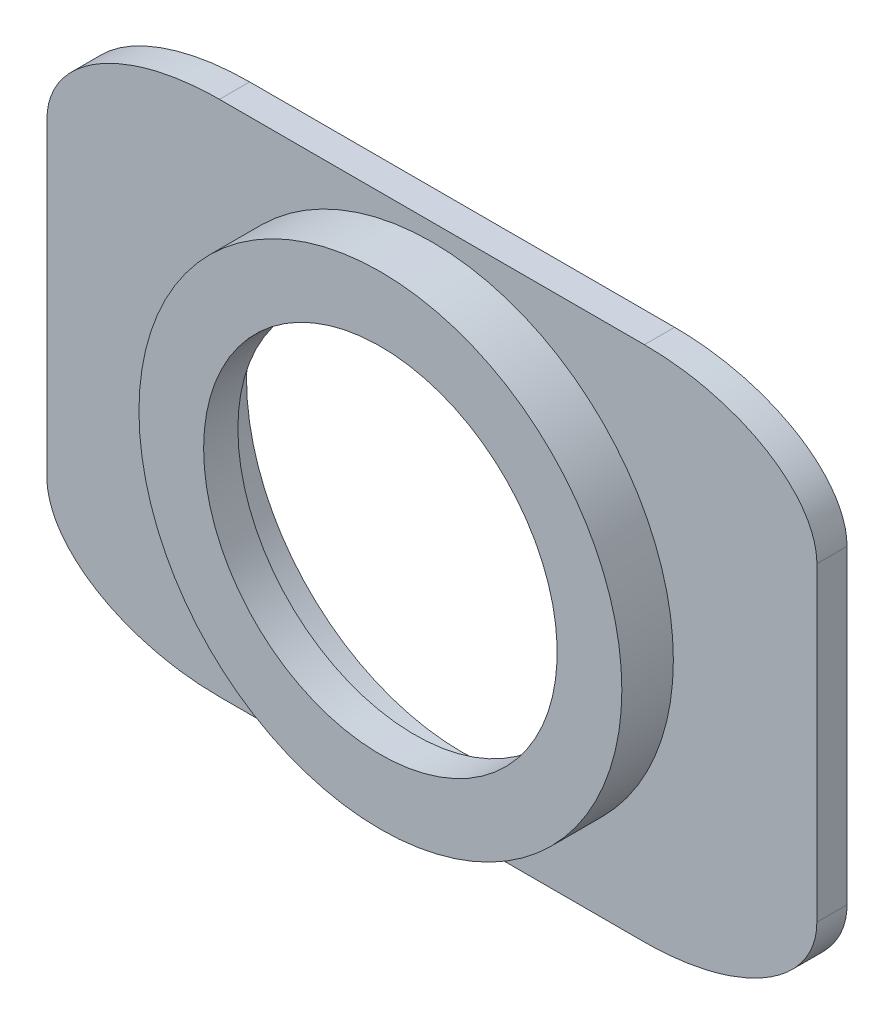
ISO-10303-21;
HEADER;
FILE_DESCRIPTION(('STEP AP214'),'2;1');
FILE_NAME('part.step','',(''),(''),'','','');
FILE_SCHEMA(('AUTOMOTIVE_DESIGN { 1 0 10303 214 1 1 1 1 }'));
ENDSEC;
DATA;
#1=APPLICATION_CONTEXT('core data for automotive mechanical design processes');
#2=APPLICATION_PROTOCOL_DEFINITION('international standard','automotive_design',2000,#1);
#3=PRODUCT_CONTEXT('',#1,'mechanical');
#4=PRODUCT('Part','Part','',(#3));
#5=PRODUCT_RELATED_PRODUCT_CATEGORY('part','',(#4));
#6=PRODUCT_DEFINITION_FORMATION('','',#4);
#7=PRODUCT_DEFINITION_CONTEXT('part definition',#1,'design');
#8=PRODUCT_DEFINITION('design','',#6,#7);
#9=PRODUCT_DEFINITION_SHAPE('','',#8);
#10=(LENGTH_UNIT() NAMED_UNIT(*) SI_UNIT(.MILLI.,.METRE.));
#11=(NAMED_UNIT(*) PLANE_ANGLE_UNIT() SI_UNIT($,.RADIAN.));
#12=(NAMED_UNIT(*) SI_UNIT($,.STERADIAN.) SOLID_ANGLE_UNIT());
#13=UNCERTAINTY_MEASURE_WITH_UNIT(LENGTH_MEASURE(1.E-05),#10,'distance_accuracy_value','');
#14=(GEOMETRIC_REPRESENTATION_CONTEXT(3) GLOBAL_UNCERTAINTY_ASSIGNED_CONTEXT((#13)) GLOBAL_UNIT_ASSIGNED_CONTEXT((#10,
#11,#12)) REPRESENTATION_CONTEXT('',''));
#15=CARTESIAN_POINT('',(0.,0.,0.));
#16=DIRECTION('',(0.,0.,1.));
#17=DIRECTION('',(1.,0.,0.));
#18=AXIS2_PLACEMENT_3D('',#15,#16,#17);
#19=CARTESIAN_POINT('',(-31.9395050243321,60.,4.10871596133464));
#20=DIRECTION('',(0.,0.,-1.));
#21=DIRECTION('',(-1.,0.,0.));
#22=AXIS2_PLACEMENT_3D('',#19,#20,#21);
#23=PLANE('',#22);
#24=CARTESIAN_POINT('',(0.,30.,4.10871596133464));
#25=DIRECTION('',(0.,0.,-1.));
#26=DIRECTION('',(-1.,0.,0.));
#27=AXIS2_PLACEMENT_3D('',#24,#25,#26);
#28=CIRCLE('',#27,20.5);
#29=CARTESIAN_POINT('',(-20.5,30.,4.10871596133464));
#30=VERTEX_POINT('',#29);
#31=EDGE_CURVE('E210',#30,#30,#28,.T.);
#32=ORIENTED_EDGE('',*,*,#31,.T.);
#33=EDGE_LOOP('',(#32));
#34=FACE_BOUND('',#33,.T.);
#35=CARTESIAN_POINT('',(0.,30.,4.10871596133464));
#36=DIRECTION('',(0.,0.,1.));
#37=DIRECTION('',(1.,0.,0.));
#38=AXIS2_PLACEMENT_3D('',#35,#36,#37);
#39=CIRCLE('',#38,28.);
#40=CARTESIAN_POINT('',(28.,30.,4.10871596133462));
#41=VERTEX_POINT('',#40);
#42=EDGE_CURVE('E586',#41,#41,#39,.T.);
#43=ORIENTED_EDGE('',*,*,#42,.T.);
#44=EDGE_LOOP('',(#43));
#45=FACE_BOUND('',#44,.T.);
#46=ADVANCED_FACE('F38',(#34,#45),#23,.F.);
#47=CARTESIAN_POINT('',(-44.6395050243321,60.,-5.36470967183922));
#48=DIRECTION('',(1.,0.,0.));
#49=DIRECTION('',(0.,0.,-1.));
#50=AXIS2_PLACEMENT_3D('',#47,#48,#49);
#51=PLANE('',#50);
#52=DIRECTION('',(0.,-1.,0.));
#53=VECTOR('',#52,1.);
#54=CARTESIAN_POINT('',(-44.6395050243321,60.,-5.36470967183922));
#55=LINE('',#54,#53);
#56=CARTESIAN_POINT('',(-44.6395050243321,48.,-5.36470967183922));
#57=VERTEX_POINT('',#56);
#58=CARTESIAN_POINT('',(-44.6395050243321,12.,-5.36470967183922));
#59=VERTEX_POINT('',#58);
#60=EDGE_CURVE('E267',#57,#59,#55,.T.);
#61=ORIENTED_EDGE('',*,*,#60,.T.);
#62=CARTESIAN_POINT('',(-44.6395050243322,12.,4.58238724299325));
#63=CARTESIAN_POINT('',(-44.6395050243322,12.,1.10879784416284));
#64=CARTESIAN_POINT('',(-44.6395050243321,12.,-2.36479155466758));
#65=CARTESIAN_POINT('',(-44.6395050243321,12.,-5.83838095349799));
#66=(BOUNDED_CURVE() B_SPLINE_CURVE(3,(#62,#63,#64,#65),.UNSPECIFIED.,.F.,
.F.) B_SPLINE_CURVE_WITH_KNOTS((4,4),(-0.000473671281658771,0.00994709691483247),
.UNSPECIFIED.) CURVE() GEOMETRIC_REPRESENTATION_ITEM() RATIONAL_B_SPLINE_CURVE((1.,1.,1.,1.)) REPRESENTATION_ITEM(''));
#67=CARTESIAN_POINT('',(-44.6395050243321,12.,-1.86470967180799));
#68=VERTEX_POINT('',#67);
#69=EDGE_CURVE('E243',#59,#68,#66,.F.);
#70=ORIENTED_EDGE('',*,*,#69,.T.);
#71=DIRECTION('',(0.,-1.,0.));
#72=VECTOR('',#71,1.);
#73=CARTESIAN_POINT('',(-44.6395050243321,60.,-1.86470967180799));
#74=LINE('',#73,#72);
#75=CARTESIAN_POINT('',(-44.6395050243321,48.,-1.86470967180799));
#76=VERTEX_POINT('',#75);
#77=EDGE_CURVE('E165',#76,#68,#74,.T.);
#78=ORIENTED_EDGE('',*,*,#77,.F.);
#79=CARTESIAN_POINT('',(-44.6395050243321,48.,-5.83838095349799));
#80=CARTESIAN_POINT('',(-44.6395050243321,48.,-2.36479155466758));
#81=CARTESIAN_POINT('',(-44.6395050243322,48.,1.10879784416284));
#82=CARTESIAN_POINT('',(-44.6395050243322,48.,4.58238724299325));
#83=(BOUNDED_CURVE() B_SPLINE_CURVE(3,(#79,#80,#81,#82),.UNSPECIFIED.,.F.,
.F.) B_SPLINE_CURVE_WITH_KNOTS((4,4),(-0.00458238724299343,0.00583838095349781),
.UNSPECIFIED.) CURVE() GEOMETRIC_REPRESENTATION_ITEM() RATIONAL_B_SPLINE_CURVE((1.,1.,1.,1.)) REPRESENTATION_ITEM(''));
#84=EDGE_CURVE('E333',#76,#57,#83,.F.);
#85=ORIENTED_EDGE('',*,*,#84,.T.);
#86=EDGE_LOOP('',(#61,#70,#78,#85));
#87=FACE_BOUND('',#86,.T.);
#88=ADVANCED_FACE('F265',(#87),#51,.F.);
#89=CARTESIAN_POINT('',(31.9395050243321,60.,-1.86470967183927));
#90=DIRECTION('',(0.,0.,-1.));
#91=DIRECTION('',(-1.,0.,0.));
#92=AXIS2_PLACEMENT_3D('',#89,#90,#91);
#93=PLANE('',#92);
#94=CARTESIAN_POINT('',(24.6395050243321,60.,-1.86470967183924));
#95=CARTESIAN_POINT('',(44.6395050243321,60.,-1.86470967183924));
#96=CARTESIAN_POINT('',(44.6395050243321,48.,-1.86470967183924));
#97=(BOUNDED_CURVE() B_SPLINE_CURVE(2,(#94,#95,#96),.UNSPECIFIED.,.F.,
.F.) B_SPLINE_CURVE_WITH_KNOTS((3,3),(0.,1.),
.UNSPECIFIED.) CURVE() GEOMETRIC_REPRESENTATION_ITEM() RATIONAL_B_SPLINE_CURVE((1.,
0.707106781186547,1.)) REPRESENTATION_ITEM(''));
#98=CARTESIAN_POINT('',(44.6395050243321,48.,-1.86470967183922));
#99=VERTEX_POINT('',#98);
#100=CARTESIAN_POINT('',(31.9395050243321,59.1720902251996,-1.86470967180782));
#101=VERTEX_POINT('',#100);
#102=EDGE_CURVE('E325',#99,#101,#97,.F.);
#103=ORIENTED_EDGE('',*,*,#102,.T.);
#104=CARTESIAN_POINT('',(24.6395050243321,60.,-1.86470967180783));
#105=CARTESIAN_POINT('',(44.6395050243321,60.,-1.86470967180783));
#106=CARTESIAN_POINT('',(44.6395050243321,48.,-1.86470967180783));
#107=(BOUNDED_CURVE() B_SPLINE_CURVE(2,(#104,#105,#106),.UNSPECIFIED.,.F.,
.F.) B_SPLINE_CURVE_WITH_KNOTS((3,3),(0.,1.),
.UNSPECIFIED.) CURVE() GEOMETRIC_REPRESENTATION_ITEM() RATIONAL_B_SPLINE_CURVE((1.,
0.707106781186547,1.)) REPRESENTATION_ITEM(''));
#108=CARTESIAN_POINT('',(24.6395049947221,59.9999999999184,-1.86470967180802));
#109=VERTEX_POINT('',#108);
#110=EDGE_CURVE('E130',#101,#109,#107,.F.);
#111=ORIENTED_EDGE('',*,*,#110,.T.);
#112=DIRECTION('',(-1.,-2.55426266336161E-13,0.));
#113=VECTOR('',#112,1.);
#114=CARTESIAN_POINT('',(24.6395050095145,60.0000000000126,-1.86470967180784));
#115=LINE('',#114,#113);
#116=CARTESIAN_POINT('',(-24.6395050243322,60.,-1.86470967180795));
#117=VERTEX_POINT('',#116);
#118=EDGE_CURVE('E122',#109,#117,#115,.T.);
#119=ORIENTED_EDGE('',*,*,#118,.T.);
#120=CARTESIAN_POINT('',(-44.6395050243322,48.,-1.86470967180802));
#121=CARTESIAN_POINT('',(-44.6395050243322,60.,-1.86470967180802));
#122=CARTESIAN_POINT('',(-24.6395050243321,60.,-1.86470967180794));
#123=(BOUNDED_CURVE() B_SPLINE_CURVE(2,(#120,#121,#122),.UNSPECIFIED.,.F.,
.F.) B_SPLINE_CURVE_WITH_KNOTS((3,3),(0.,1.),
.UNSPECIFIED.) CURVE() GEOMETRIC_REPRESENTATION_ITEM() RATIONAL_B_SPLINE_CURVE((1.,
0.707106781186547,1.)) REPRESENTATION_ITEM(''));
#124=CARTESIAN_POINT('',(-31.9395050243321,59.1720902251996,-1.86470967180796));
#125=VERTEX_POINT('',#124);
#126=EDGE_CURVE('E127',#117,#125,#123,.F.);
#127=ORIENTED_EDGE('',*,*,#126,.T.);
#128=CARTESIAN_POINT('',(-44.6395050243321,48.,-1.864709671808));
#129=CARTESIAN_POINT('',(-44.6395050243321,60.,-1.864709671808));
#130=CARTESIAN_POINT('',(-24.6395050243321,60.,-1.86470967180792));
#131=(BOUNDED_CURVE() B_SPLINE_CURVE(2,(#128,#129,#130),.UNSPECIFIED.,.F.,
.F.) B_SPLINE_CURVE_WITH_KNOTS((3,3),(0.,1.),
.UNSPECIFIED.) CURVE() GEOMETRIC_REPRESENTATION_ITEM() RATIONAL_B_SPLINE_CURVE((1.,
0.707106781186547,1.)) REPRESENTATION_ITEM(''));
#132=EDGE_CURVE('E145',#125,#76,#131,.F.);
#133=ORIENTED_EDGE('',*,*,#132,.T.);
#134=ORIENTED_EDGE('',*,*,#77,.T.);
#135=CARTESIAN_POINT('',(-24.6395050243321,0.,-1.86470967180792));
#136=CARTESIAN_POINT('',(-44.6395050243322,0.,-1.864709671808));
#137=CARTESIAN_POINT('',(-44.6395050243321,12.,-1.864709671808));
#138=(BOUNDED_CURVE() B_SPLINE_CURVE(2,(#135,#136,#137),.UNSPECIFIED.,.F.,
.F.) B_SPLINE_CURVE_WITH_KNOTS((3,3),(0.,1.),
.UNSPECIFIED.) CURVE() GEOMETRIC_REPRESENTATION_ITEM() RATIONAL_B_SPLINE_CURVE((1.,
0.707106781186548,1.)) REPRESENTATION_ITEM(''));
#139=CARTESIAN_POINT('',(-31.9395050243321,0.82790977480042,-1.86470967180796));
#140=VERTEX_POINT('',#139);
#141=EDGE_CURVE('E252',#68,#140,#138,.F.);
#142=ORIENTED_EDGE('',*,*,#141,.T.);
#143=CARTESIAN_POINT('',(-24.6395050243321,0.,-1.86470967180794));
#144=CARTESIAN_POINT('',(-44.6395050243321,0.,-1.86470967180802));
#145=CARTESIAN_POINT('',(-44.6395050243321,12.,-1.86470967180802));
#146=(BOUNDED_CURVE() B_SPLINE_CURVE(2,(#143,#144,#145),.UNSPECIFIED.,.F.,
.F.) B_SPLINE_CURVE_WITH_KNOTS((3,3),(0.,1.),
.UNSPECIFIED.) CURVE() GEOMETRIC_REPRESENTATION_ITEM() RATIONAL_B_SPLINE_CURVE((1.,
0.707106781186548,1.)) REPRESENTATION_ITEM(''));
#147=CARTESIAN_POINT('',(-24.6395049947123,-3.40224868039143E-11,-1.86470967180802));
#148=VERTEX_POINT('',#147);
#149=EDGE_CURVE('E12',#140,#148,#146,.F.);
#150=ORIENTED_EDGE('',*,*,#149,.T.);
#151=DIRECTION('',(1.,1.37536269902158E-12,0.));
#152=VECTOR('',#151,1.);
#153=CARTESIAN_POINT('',(-24.6395050095296,-6.77765122452835E-11,-1.86470967180795));
#154=LINE('',#153,#152);
#155=CARTESIAN_POINT('',(24.6395050243321,0.,-1.86470967180784));
#156=VERTEX_POINT('',#155);
#157=EDGE_CURVE('E135',#148,#156,#154,.T.);
#158=ORIENTED_EDGE('',*,*,#157,.T.);
#159=CARTESIAN_POINT('',(44.6395050243321,12.,-1.86470967180783));
#160=CARTESIAN_POINT('',(44.6395050243321,0.,-1.86470967180783));
#161=CARTESIAN_POINT('',(24.6395050243321,0.,-1.86470967180783));
#162=(BOUNDED_CURVE() B_SPLINE_CURVE(2,(#159,#160,#161),.UNSPECIFIED.,.F.,
.F.) B_SPLINE_CURVE_WITH_KNOTS((3,3),(0.,1.),
.UNSPECIFIED.) CURVE() GEOMETRIC_REPRESENTATION_ITEM() RATIONAL_B_SPLINE_CURVE((1.,
0.707106781186548,1.)) REPRESENTATION_ITEM(''));
#163=CARTESIAN_POINT('',(31.939505023876,0.827909775042046,-1.86470967180802));
#164=VERTEX_POINT('',#163);
#165=EDGE_CURVE('E419',#156,#164,#162,.F.);
#166=ORIENTED_EDGE('',*,*,#165,.T.);
#167=CARTESIAN_POINT('',(44.6395050243321,12.,-1.86470967183924));
#168=CARTESIAN_POINT('',(44.6395050243321,0.,-1.86470967183924));
#169=CARTESIAN_POINT('',(24.6395050243321,0.,-1.86470967183924));
#170=(BOUNDED_CURVE() B_SPLINE_CURVE(2,(#167,#168,#169),.UNSPECIFIED.,.F.,
.F.) B_SPLINE_CURVE_WITH_KNOTS((3,3),(0.,1.),
.UNSPECIFIED.) CURVE() GEOMETRIC_REPRESENTATION_ITEM() RATIONAL_B_SPLINE_CURVE((1.,
0.707106781186548,1.)) REPRESENTATION_ITEM(''));
#171=CARTESIAN_POINT('',(44.6395050243321,12.,-1.86470967183922));
#172=VERTEX_POINT('',#171);
#173=EDGE_CURVE('E268',#164,#172,#170,.F.);
#174=ORIENTED_EDGE('',*,*,#173,.T.);
#175=DIRECTION('',(0.,-1.,0.));
#176=VECTOR('',#175,1.);
#177=CARTESIAN_POINT('',(44.6395050243321,60.,-1.86470967183922));
#178=LINE('',#177,#176);
#179=EDGE_CURVE('E270',#99,#172,#178,.T.);
#180=ORIENTED_EDGE('',*,*,#179,.F.);
#181=EDGE_LOOP('',(#103,#111,#119,#127,#133,#134,#142,#150,#158,#166,#174,#180));
#182=FACE_BOUND('',#181,.T.);
#183=CARTESIAN_POINT('',(0.,30.,-1.86470967180789));
#184=DIRECTION('',(0.,0.,-1.));
#185=DIRECTION('',(-1.,0.,0.));
#186=AXIS2_PLACEMENT_3D('',#183,#184,#185);
#187=CIRCLE('',#186,28.);
#188=CARTESIAN_POINT('',(28.,30.,-1.86470967180784));
#189=VERTEX_POINT('',#188);
#190=EDGE_CURVE('E589',#189,#189,#187,.F.);
#191=ORIENTED_EDGE('',*,*,#190,.F.);
#192=EDGE_LOOP('',(#191));
#193=FACE_BOUND('',#192,.T.);
#194=ADVANCED_FACE('F125',(#182,#193),#93,.F.);
#195=CARTESIAN_POINT('',(44.6395050243321,60.,-1.86470967183922));
#196=DIRECTION('',(-1.,0.,0.));
#197=DIRECTION('',(0.,0.,1.));
#198=AXIS2_PLACEMENT_3D('',#195,#196,#197);
#199=PLANE('',#198);
#200=ORIENTED_EDGE('',*,*,#179,.T.);
#201=CARTESIAN_POINT('',(44.6395050243321,12.,-5.83838095349791));
#202=CARTESIAN_POINT('',(44.6395050243321,12.,-2.36479155466749));
#203=CARTESIAN_POINT('',(44.6395050243321,12.,1.10879784416291));
#204=CARTESIAN_POINT('',(44.6395050243321,12.,4.58238724299333));
#205=(BOUNDED_CURVE() B_SPLINE_CURVE(3,(#201,#202,#203,#204),.UNSPECIFIED.,.F.,
.F.) B_SPLINE_CURVE_WITH_KNOTS((4,4),(-0.00644709691483254,0.0039736712816587),
.UNSPECIFIED.) CURVE() GEOMETRIC_REPRESENTATION_ITEM() RATIONAL_B_SPLINE_CURVE((1.,1.,1.,1.)) REPRESENTATION_ITEM(''));
#206=CARTESIAN_POINT('',(44.6395050243321,12.,-5.36470967183922));
#207=VERTEX_POINT('',#206);
#208=EDGE_CURVE('E324',#172,#207,#205,.F.);
#209=ORIENTED_EDGE('',*,*,#208,.T.);
#210=DIRECTION('',(0.,-1.,0.));
#211=VECTOR('',#210,1.);
#212=CARTESIAN_POINT('',(44.6395050243321,60.,-5.36470967183922));
#213=LINE('',#212,#211);
#214=CARTESIAN_POINT('',(44.6395050243321,48.,-5.36470967183922));
#215=VERTEX_POINT('',#214);
#216=EDGE_CURVE('E272',#215,#207,#213,.T.);
#217=ORIENTED_EDGE('',*,*,#216,.F.);
#218=CARTESIAN_POINT('',(44.6395050243321,48.,4.58238724299333));
#219=CARTESIAN_POINT('',(44.6395050243321,48.,1.10879784416291));
#220=CARTESIAN_POINT('',(44.6395050243321,48.,-2.3647915546675));
#221=CARTESIAN_POINT('',(44.6395050243321,48.,-5.83838095349791));
#222=(BOUNDED_CURVE() B_SPLINE_CURVE(3,(#218,#219,#220,#221),.UNSPECIFIED.,.F.,
.F.) B_SPLINE_CURVE_WITH_KNOTS((4,4),(-0.00583838095349791,0.00458238724299333),
.UNSPECIFIED.) CURVE() GEOMETRIC_REPRESENTATION_ITEM() RATIONAL_B_SPLINE_CURVE((1.,1.,1.,1.)) REPRESENTATION_ITEM(''));
#223=EDGE_CURVE('E327',#215,#99,#222,.F.);
#224=ORIENTED_EDGE('',*,*,#223,.T.);
#225=EDGE_LOOP('',(#200,#209,#217,#224));
#226=FACE_BOUND('',#225,.T.);
#227=ADVANCED_FACE('F538',(#226),#199,.F.);
#228=CARTESIAN_POINT('',(44.6395050243321,60.,-5.36470967183922));
#229=DIRECTION('',(0.,0.,1.));
#230=DIRECTION('',(1.,0.,0.));
#231=AXIS2_PLACEMENT_3D('',#228,#229,#230);
#232=PLANE('',#231);
#233=CARTESIAN_POINT('',(0.,30.,-5.36470967183922));
#234=DIRECTION('',(0.,0.,-1.));
#235=DIRECTION('',(-1.,0.,0.));
#236=AXIS2_PLACEMENT_3D('',#233,#234,#235);
#237=CIRCLE('',#236,25.);
#238=CARTESIAN_POINT('',(-25.,30.,-5.36470967183922));
#239=VERTEX_POINT('',#238);
#240=EDGE_CURVE('E297',#239,#239,#237,.T.);
#241=ORIENTED_EDGE('',*,*,#240,.F.);
#242=EDGE_LOOP('',(#241));
#243=FACE_BOUND('',#242,.T.);
#244=DIRECTION('',(-1.,0.,0.));
#245=VECTOR('',#244,1.);
#246=CARTESIAN_POINT('',(44.6395050243321,0.,-5.36470967183922));
#247=LINE('',#246,#245);
#248=CARTESIAN_POINT('',(24.6395050243322,0.,-5.36470967183922));
#249=VERTEX_POINT('',#248);
#250=CARTESIAN_POINT('',(-24.6395050243321,0.,-5.36470967183922));
#251=VERTEX_POINT('',#250);
#252=EDGE_CURVE('E293',#249,#251,#247,.T.);
#253=ORIENTED_EDGE('',*,*,#252,.T.);
#254=CARTESIAN_POINT('',(-44.6395050243322,12.,-5.36470967183926));
#255=CARTESIAN_POINT('',(-44.6395050243321,0.,-5.36470967183925));
#256=CARTESIAN_POINT('',(-24.6395050243321,0.,-5.36470967183918));
#257=(BOUNDED_CURVE() B_SPLINE_CURVE(2,(#254,#255,#256),.UNSPECIFIED.,.F.,
.F.) B_SPLINE_CURVE_WITH_KNOTS((3,3),(0.,1.),
.UNSPECIFIED.) CURVE() GEOMETRIC_REPRESENTATION_ITEM() RATIONAL_B_SPLINE_CURVE((1.,
0.707106781186548,1.)) REPRESENTATION_ITEM(''));
#258=EDGE_CURVE('E53',#251,#59,#257,.F.);
#259=ORIENTED_EDGE('',*,*,#258,.T.);
#260=ORIENTED_EDGE('',*,*,#60,.F.);
#261=CARTESIAN_POINT('',(-24.6395050243321,60.,-5.36470967183918));
#262=CARTESIAN_POINT('',(-44.6395050243321,60.,-5.36470967183926));
#263=CARTESIAN_POINT('',(-44.6395050243321,48.,-5.36470967183926));
#264=(BOUNDED_CURVE() B_SPLINE_CURVE(2,(#261,#262,#263),.UNSPECIFIED.,.F.,
.F.) B_SPLINE_CURVE_WITH_KNOTS((3,3),(0.,1.),
.UNSPECIFIED.) CURVE() GEOMETRIC_REPRESENTATION_ITEM() RATIONAL_B_SPLINE_CURVE((1.,
0.707106781186547,1.)) REPRESENTATION_ITEM(''));
#265=CARTESIAN_POINT('',(-24.6395050243321,60.,-5.36470967183922));
#266=VERTEX_POINT('',#265);
#267=EDGE_CURVE('E330',#57,#266,#264,.F.);
#268=ORIENTED_EDGE('',*,*,#267,.T.);
#269=DIRECTION('',(-1.,0.,0.));
#270=VECTOR('',#269,1.);
#271=CARTESIAN_POINT('',(44.6395050243321,60.,-5.36470967183922));
#272=LINE('',#271,#270);
#273=CARTESIAN_POINT('',(24.6395050243322,60.,-5.36470967183922));
#274=VERTEX_POINT('',#273);
#275=EDGE_CURVE('E154',#274,#266,#272,.T.);
#276=ORIENTED_EDGE('',*,*,#275,.F.);
#277=CARTESIAN_POINT('',(44.6395050243321,48.,-5.36470967183922));
#278=CARTESIAN_POINT('',(44.6395050243321,60.,-5.36470967183922));
#279=CARTESIAN_POINT('',(24.6395050243321,60.,-5.36470967183922));
#280=(BOUNDED_CURVE() B_SPLINE_CURVE(2,(#277,#278,#279),.UNSPECIFIED.,.F.,
.F.) B_SPLINE_CURVE_WITH_KNOTS((3,3),(0.,1.),
.UNSPECIFIED.) CURVE() GEOMETRIC_REPRESENTATION_ITEM() RATIONAL_B_SPLINE_CURVE((1.,
0.707106781186547,1.)) REPRESENTATION_ITEM(''));
#281=EDGE_CURVE('E332',#274,#215,#280,.F.);
#282=ORIENTED_EDGE('',*,*,#281,.T.);
#283=ORIENTED_EDGE('',*,*,#216,.T.);
#284=CARTESIAN_POINT('',(24.6395050243321,0.,-5.36470967183922));
#285=CARTESIAN_POINT('',(44.6395050243321,0.,-5.36470967183922));
#286=CARTESIAN_POINT('',(44.6395050243321,12.,-5.36470967183922));
#287=(BOUNDED_CURVE() B_SPLINE_CURVE(2,(#284,#285,#286),.UNSPECIFIED.,.F.,
.F.) B_SPLINE_CURVE_WITH_KNOTS((3,3),(0.,1.),
.UNSPECIFIED.) CURVE() GEOMETRIC_REPRESENTATION_ITEM() RATIONAL_B_SPLINE_CURVE((1.,
0.707106781186548,1.)) REPRESENTATION_ITEM(''));
#288=EDGE_CURVE('E310',#207,#249,#287,.F.);
#289=ORIENTED_EDGE('',*,*,#288,.T.);
#290=EDGE_LOOP('',(#253,#259,#260,#268,#276,#282,#283,#289));
#291=FACE_BOUND('',#290,.T.);
#292=ADVANCED_FACE('F178',(#243,#291),#232,.F.);
#293=CARTESIAN_POINT('',(0.,60.,0.));
#294=DIRECTION('',(0.,1.,0.));
#295=DIRECTION('',(0.,0.,1.));
#296=AXIS2_PLACEMENT_3D('',#293,#294,#295);
#297=PLANE('',#296);
#298=ORIENTED_EDGE('',*,*,#118,.F.);
#299=CARTESIAN_POINT('',(24.6395050243321,60.,-5.83838095349791));
#300=CARTESIAN_POINT('',(24.6395050243321,60.,-2.3647915546675));
#301=CARTESIAN_POINT('',(24.6395050243321,60.,1.10879784416291));
#302=CARTESIAN_POINT('',(24.6395050243321,60.,4.58238724299333));
#303=(BOUNDED_CURVE() B_SPLINE_CURVE(3,(#299,#300,#301,#302),.UNSPECIFIED.,.F.,
.F.) B_SPLINE_CURVE_WITH_KNOTS((4,4),(-0.00583838095349791,0.00458238724299333),
.UNSPECIFIED.) CURVE() GEOMETRIC_REPRESENTATION_ITEM() RATIONAL_B_SPLINE_CURVE((1.,1.,1.,1.)) REPRESENTATION_ITEM(''));
#304=EDGE_CURVE('E155',#109,#274,#303,.F.);
#305=ORIENTED_EDGE('',*,*,#304,.T.);
#306=ORIENTED_EDGE('',*,*,#275,.T.);
#307=CARTESIAN_POINT('',(-24.6395050243322,60.,4.58238724299333));
#308=CARTESIAN_POINT('',(-24.6395050243322,60.,1.10879784416292));
#309=CARTESIAN_POINT('',(-24.6395050243321,60.,-2.3647915546675));
#310=CARTESIAN_POINT('',(-24.6395050243321,60.,-5.83838095349791));
#311=(BOUNDED_CURVE() B_SPLINE_CURVE(3,(#307,#308,#309,#310),.UNSPECIFIED.,.F.,
.F.) B_SPLINE_CURVE_WITH_KNOTS((4,4),(-0.00458238724299343,0.00583838095349781),
.UNSPECIFIED.) CURVE() GEOMETRIC_REPRESENTATION_ITEM() RATIONAL_B_SPLINE_CURVE((1.,1.,1.,1.)) REPRESENTATION_ITEM(''));
#312=EDGE_CURVE('E142',#266,#117,#311,.F.);
#313=ORIENTED_EDGE('',*,*,#312,.T.);
#314=EDGE_LOOP('',(#298,#305,#306,#313));
#315=FACE_BOUND('',#314,.T.);
#316=ADVANCED_FACE('F152',(#315),#297,.T.);
#317=CARTESIAN_POINT('',(0.,0.,0.));
#318=DIRECTION('',(0.,1.,0.));
#319=DIRECTION('',(0.,0.,1.));
#320=AXIS2_PLACEMENT_3D('',#317,#318,#319);
#321=PLANE('',#320);
#322=CARTESIAN_POINT('',(24.6395050243321,0.,4.58238724299333));
#323=CARTESIAN_POINT('',(24.6395050243321,0.,1.10879784416291));
#324=CARTESIAN_POINT('',(24.6395050243321,0.,-2.36479155466749));
#325=CARTESIAN_POINT('',(24.6395050243321,0.,-5.83838095349791));
#326=(BOUNDED_CURVE() B_SPLINE_CURVE(3,(#322,#323,#324,#325),.UNSPECIFIED.,.F.,
.F.) B_SPLINE_CURVE_WITH_KNOTS((4,4),(-0.00644709691483254,0.0039736712816587),
.UNSPECIFIED.) CURVE() GEOMETRIC_REPRESENTATION_ITEM() RATIONAL_B_SPLINE_CURVE((1.,1.,1.,1.)) REPRESENTATION_ITEM(''));
#327=EDGE_CURVE('E320',#249,#156,#326,.F.);
#328=ORIENTED_EDGE('',*,*,#327,.T.);
#329=ORIENTED_EDGE('',*,*,#157,.F.);
#330=CARTESIAN_POINT('',(-24.6395050243321,0.,-5.83838095349791));
#331=CARTESIAN_POINT('',(-24.6395050243321,0.,-2.3647915546675));
#332=CARTESIAN_POINT('',(-24.6395050243322,0.,1.10879784416291));
#333=CARTESIAN_POINT('',(-24.6395050243322,0.,4.58238724299333));
#334=(BOUNDED_CURVE() B_SPLINE_CURVE(3,(#330,#331,#332,#333),.UNSPECIFIED.,.F.,
.F.) B_SPLINE_CURVE_WITH_KNOTS((4,4),(-0.000473671281658772,0.00994709691483247),
.UNSPECIFIED.) CURVE() GEOMETRIC_REPRESENTATION_ITEM() RATIONAL_B_SPLINE_CURVE((1.,1.,1.,1.)) REPRESENTATION_ITEM(''));
#335=EDGE_CURVE('E60',#148,#251,#334,.F.);
#336=ORIENTED_EDGE('',*,*,#335,.T.);
#337=ORIENTED_EDGE('',*,*,#252,.F.);
#338=EDGE_LOOP('',(#328,#329,#336,#337));
#339=FACE_BOUND('',#338,.T.);
#340=ADVANCED_FACE('F177',(#339),#321,.F.);
#341=CARTESIAN_POINT('',(0.,30.,0.135290328160781));
#342=DIRECTION('',(0.,0.,-1.));
#343=DIRECTION('',(-1.,0.,0.));
#344=AXIS2_PLACEMENT_3D('',#341,#342,#343);
#345=CYLINDRICAL_SURFACE('',#344,25.);
#346=CARTESIAN_POINT('',(0.,30.,0.135290328160781));
#347=DIRECTION('',(0.,0.,-1.));
#348=DIRECTION('',(-1.,0.,0.));
#349=AXIS2_PLACEMENT_3D('',#346,#347,#348);
#350=CIRCLE('',#349,25.);
#351=CARTESIAN_POINT('',(-25.,30.,0.135290328160781));
#352=VERTEX_POINT('',#351);
#353=EDGE_CURVE('E304',#352,#352,#350,.T.);
#354=ORIENTED_EDGE('',*,*,#353,.F.);
#355=EDGE_LOOP('',(#354));
#356=FACE_BOUND('',#355,.T.);
#357=ORIENTED_EDGE('',*,*,#240,.T.);
#358=EDGE_LOOP('',(#357));
#359=FACE_BOUND('',#358,.T.);
#360=ADVANCED_FACE('F179',(#356,#359),#345,.F.);
#361=CARTESIAN_POINT('',(0.,30.,0.135290328160781));
#362=DIRECTION('',(0.,0.,-1.));
#363=DIRECTION('',(-1.,0.,0.));
#364=AXIS2_PLACEMENT_3D('',#361,#362,#363);
#365=PLANE('',#364);
#366=CARTESIAN_POINT('',(0.,30.,0.135290328160781));
#367=DIRECTION('',(0.,0.,-1.));
#368=DIRECTION('',(-1.,0.,0.));
#369=AXIS2_PLACEMENT_3D('',#366,#367,#368);
#370=CIRCLE('',#369,20.5);
#371=CARTESIAN_POINT('',(-20.5,30.,0.135290328160781));
#372=VERTEX_POINT('',#371);
#373=EDGE_CURVE('E147',#372,#372,#370,.T.);
#374=ORIENTED_EDGE('',*,*,#373,.F.);
#375=EDGE_LOOP('',(#374));
#376=FACE_BOUND('',#375,.T.);
#377=ORIENTED_EDGE('',*,*,#353,.T.);
#378=EDGE_LOOP('',(#377));
#379=FACE_BOUND('',#378,.T.);
#380=ADVANCED_FACE('F363',(#376,#379),#365,.T.);
#381=CARTESIAN_POINT('',(-44.6395050243322,48.,4.58238724299325));
#382=CARTESIAN_POINT('',(-44.6395050243322,48.,1.10879784416284));
#383=CARTESIAN_POINT('',(-44.6395050243321,48.,-2.36479155466758));
#384=CARTESIAN_POINT('',(-44.6395050243321,48.,-5.83838095349799));
#385=CARTESIAN_POINT('',(-44.6395050243322,60.,4.58238724299325));
#386=CARTESIAN_POINT('',(-44.6395050243322,60.,1.10879784416284));
#387=CARTESIAN_POINT('',(-44.6395050243321,60.,-2.36479155466758));
#388=CARTESIAN_POINT('',(-44.6395050243321,60.,-5.83838095349799));
#389=CARTESIAN_POINT('',(-24.6395050243322,60.,4.58238724299333));
#390=CARTESIAN_POINT('',(-24.6395050243322,60.,1.10879784416292));
#391=CARTESIAN_POINT('',(-24.6395050243321,60.,-2.3647915546675));
#392=CARTESIAN_POINT('',(-24.6395050243321,60.,-5.83838095349791));
#393=(BOUNDED_SURFACE() B_SPLINE_SURFACE(2,3,((#381,#382,#383,#384),(#385,#386,#387,#388),(#389,
#390,#391,#392)),.UNSPECIFIED.,.F.,.F.,.F.) B_SPLINE_SURFACE_WITH_KNOTS((3,3),(4,4),(0.,1.),
(-0.00458238724299343,0.00583838095349781),
.UNSPECIFIED.) GEOMETRIC_REPRESENTATION_ITEM() RATIONAL_B_SPLINE_SURFACE(((1.,1.,1.,1.),
(0.707106781186547,0.707106781186547,0.707106781186547,0.707106781186547),(1.,1.,1.,1.))) REPRESENTATION_ITEM('') SURFACE());
#394=ORIENTED_EDGE('',*,*,#126,.F.);
#395=ORIENTED_EDGE('',*,*,#312,.F.);
#396=ORIENTED_EDGE('',*,*,#267,.F.);
#397=ORIENTED_EDGE('',*,*,#84,.F.);
#398=ORIENTED_EDGE('',*,*,#132,.F.);
#399=EDGE_LOOP('',(#394,#395,#396,#397,#398));
#400=FACE_BOUND('',#399,.T.);
#401=ADVANCED_FACE('F140',(#400),#393,.T.);
#402=CARTESIAN_POINT('',(44.6395050243321,48.,-5.83838095349791));
#403=CARTESIAN_POINT('',(44.6395050243321,48.,-2.3647915546675));
#404=CARTESIAN_POINT('',(44.6395050243321,48.,1.10879784416291));
#405=CARTESIAN_POINT('',(44.6395050243321,48.,4.58238724299333));
#406=CARTESIAN_POINT('',(44.6395050243321,60.,-5.83838095349791));
#407=CARTESIAN_POINT('',(44.6395050243321,60.,-2.3647915546675));
#408=CARTESIAN_POINT('',(44.6395050243321,60.,1.10879784416291));
#409=CARTESIAN_POINT('',(44.6395050243321,60.,4.58238724299333));
#410=CARTESIAN_POINT('',(24.6395050243321,60.,-5.83838095349791));
#411=CARTESIAN_POINT('',(24.6395050243321,60.,-2.3647915546675));
#412=CARTESIAN_POINT('',(24.6395050243321,60.,1.10879784416291));
#413=CARTESIAN_POINT('',(24.6395050243321,60.,4.58238724299333));
#414=(BOUNDED_SURFACE() B_SPLINE_SURFACE(2,3,((#402,#403,#404,#405),(#406,#407,#408,#409),(#410,
#411,#412,#413)),.UNSPECIFIED.,.F.,.F.,.F.) B_SPLINE_SURFACE_WITH_KNOTS((3,3),(4,4),(0.,1.),
(-0.00583838095349791,0.00458238724299333),
.UNSPECIFIED.) GEOMETRIC_REPRESENTATION_ITEM() RATIONAL_B_SPLINE_SURFACE(((1.,1.,1.,1.),
(0.707106781186547,0.707106781186547,0.707106781186547,0.707106781186547),(1.,1.,1.,1.))) REPRESENTATION_ITEM('') SURFACE());
#415=ORIENTED_EDGE('',*,*,#110,.F.);
#416=ORIENTED_EDGE('',*,*,#102,.F.);
#417=ORIENTED_EDGE('',*,*,#223,.F.);
#418=ORIENTED_EDGE('',*,*,#281,.F.);
#419=ORIENTED_EDGE('',*,*,#304,.F.);
#420=EDGE_LOOP('',(#415,#416,#417,#418,#419));
#421=FACE_BOUND('',#420,.T.);
#422=ADVANCED_FACE('F362',(#421),#414,.T.);
#423=CARTESIAN_POINT('',(44.6395050243321,12.,4.58238724299333));
#424=CARTESIAN_POINT('',(44.6395050243321,12.,1.10879784416291));
#425=CARTESIAN_POINT('',(44.6395050243321,12.,-2.36479155466749));
#426=CARTESIAN_POINT('',(44.6395050243321,12.,-5.83838095349791));
#427=CARTESIAN_POINT('',(44.6395050243321,0.,4.58238724299333));
#428=CARTESIAN_POINT('',(44.6395050243321,0.,1.10879784416292));
#429=CARTESIAN_POINT('',(44.6395050243321,0.,-2.3647915546675));
#430=CARTESIAN_POINT('',(44.6395050243321,0.,-5.83838095349791));
#431=CARTESIAN_POINT('',(24.6395050243321,0.,4.58238724299333));
#432=CARTESIAN_POINT('',(24.6395050243321,0.,1.10879784416291));
#433=CARTESIAN_POINT('',(24.6395050243321,0.,-2.36479155466749));
#434=CARTESIAN_POINT('',(24.6395050243321,0.,-5.83838095349791));
#435=(BOUNDED_SURFACE() B_SPLINE_SURFACE(2,3,((#423,#424,#425,#426),(#427,#428,#429,#430),(#431,
#432,#433,#434)),.UNSPECIFIED.,.F.,.F.,.F.) B_SPLINE_SURFACE_WITH_KNOTS((3,3),(4,4),(0.,1.),
(-0.00644709691483254,0.0039736712816587),
.UNSPECIFIED.) GEOMETRIC_REPRESENTATION_ITEM() RATIONAL_B_SPLINE_SURFACE(((1.,1.,1.,1.),
(0.707106781186548,0.707106781186548,0.707106781186548,0.707106781186548),(1.,1.,1.,1.))) REPRESENTATION_ITEM('') SURFACE());
#436=ORIENTED_EDGE('',*,*,#165,.F.);
#437=ORIENTED_EDGE('',*,*,#327,.F.);
#438=ORIENTED_EDGE('',*,*,#288,.F.);
#439=ORIENTED_EDGE('',*,*,#208,.F.);
#440=ORIENTED_EDGE('',*,*,#173,.F.);
#441=EDGE_LOOP('',(#436,#437,#438,#439,#440));
#442=FACE_BOUND('',#441,.T.);
#443=ADVANCED_FACE('F424',(#442),#435,.T.);
#444=CARTESIAN_POINT('',(-44.6395050243321,12.,-5.83838095349799));
#445=CARTESIAN_POINT('',(-44.6395050243321,12.,-2.36479155466758));
#446=CARTESIAN_POINT('',(-44.6395050243322,12.,1.10879784416284));
#447=CARTESIAN_POINT('',(-44.6395050243322,12.,4.58238724299325));
#448=CARTESIAN_POINT('',(-44.6395050243321,0.,-5.83838095349799));
#449=CARTESIAN_POINT('',(-44.6395050243321,0.,-2.36479155466757));
#450=CARTESIAN_POINT('',(-44.6395050243322,0.,1.10879784416283));
#451=CARTESIAN_POINT('',(-44.6395050243322,0.,4.58238724299325));
#452=CARTESIAN_POINT('',(-24.6395050243321,0.,-5.83838095349791));
#453=CARTESIAN_POINT('',(-24.6395050243321,0.,-2.3647915546675));
#454=CARTESIAN_POINT('',(-24.6395050243322,0.,1.10879784416291));
#455=CARTESIAN_POINT('',(-24.6395050243322,0.,4.58238724299333));
#456=(BOUNDED_SURFACE() B_SPLINE_SURFACE(2,3,((#444,#445,#446,#447),(#448,#449,#450,#451),(#452,
#453,#454,#455)),.UNSPECIFIED.,.F.,.F.,.F.) B_SPLINE_SURFACE_WITH_KNOTS((3,3),(4,4),(0.,1.),
(-0.000473671281658772,0.00994709691483247),
.UNSPECIFIED.) GEOMETRIC_REPRESENTATION_ITEM() RATIONAL_B_SPLINE_SURFACE(((1.,1.,1.,1.),
(0.707106781186548,0.707106781186548,0.707106781186548,0.707106781186548),(1.,1.,1.,1.))) REPRESENTATION_ITEM('') SURFACE());
#457=ORIENTED_EDGE('',*,*,#149,.F.);
#458=ORIENTED_EDGE('',*,*,#141,.F.);
#459=ORIENTED_EDGE('',*,*,#69,.F.);
#460=ORIENTED_EDGE('',*,*,#258,.F.);
#461=ORIENTED_EDGE('',*,*,#335,.F.);
#462=EDGE_LOOP('',(#457,#458,#459,#460,#461));
#463=FACE_BOUND('',#462,.T.);
#464=ADVANCED_FACE('F41',(#463),#456,.T.);
#465=CARTESIAN_POINT('',(0.,30.,8.63529032816078));
#466=DIRECTION('',(0.,0.,-1.));
#467=DIRECTION('',(-1.,0.,0.));
#468=AXIS2_PLACEMENT_3D('',#465,#466,#467);
#469=CYLINDRICAL_SURFACE('',#468,20.5);
#470=ORIENTED_EDGE('',*,*,#373,.T.);
#471=EDGE_LOOP('',(#470));
#472=FACE_BOUND('',#471,.T.);
#473=ORIENTED_EDGE('',*,*,#31,.F.);
#474=EDGE_LOOP('',(#473));
#475=FACE_BOUND('',#474,.T.);
#476=ADVANCED_FACE('F609',(#472,#475),#469,.F.);
#477=CARTESIAN_POINT('',(0.,30.,-89.5033308680496));
#478=DIRECTION('',(0.,0.,1.));
#479=DIRECTION('',(1.,0.,0.));
#480=AXIS2_PLACEMENT_3D('',#477,#478,#479);
#481=CYLINDRICAL_SURFACE('',#480,28.);
#482=CARTESIAN_POINT('',(28.,30.,4.10871596133462));
#483=CARTESIAN_POINT('',(28.,30.,4.04649277765605));
#484=CARTESIAN_POINT('',(28.,30.,3.98426959397749));
#485=CARTESIAN_POINT('',(28.,30.,3.85982322662035));
#486=CARTESIAN_POINT('',(28.,30.,3.79760004294178));
#487=CARTESIAN_POINT('',(28.,30.,3.67315367558465));
#488=CARTESIAN_POINT('',(28.,30.,3.61093049190608));
#489=CARTESIAN_POINT('',(28.,30.,3.48648412454894));
#490=CARTESIAN_POINT('',(28.,30.,3.42426094087038));
#491=CARTESIAN_POINT('',(28.,30.,3.29981457351324));
#492=CARTESIAN_POINT('',(28.,30.,3.23759138983468));
#493=CARTESIAN_POINT('',(28.,30.,3.11314502247755));
#494=CARTESIAN_POINT('',(28.,30.,3.05092183879898));
#495=CARTESIAN_POINT('',(28.,30.,2.92647547144185));
#496=CARTESIAN_POINT('',(28.,30.,2.86425228776328));
#497=CARTESIAN_POINT('',(28.,30.,2.73980592040614));
#498=CARTESIAN_POINT('',(28.,30.,2.67758273672757));
#499=CARTESIAN_POINT('',(28.,30.,2.55313636937044));
#500=CARTESIAN_POINT('',(28.,30.,2.49091318569187));
#501=CARTESIAN_POINT('',(28.,30.,2.36646681833474));
#502=CARTESIAN_POINT('',(28.,30.,2.30424363465617));
#503=CARTESIAN_POINT('',(28.,30.,2.17979726729903));
#504=CARTESIAN_POINT('',(28.,30.,2.11757408362046));
#505=CARTESIAN_POINT('',(28.,30.,1.99312771626333));
#506=CARTESIAN_POINT('',(28.,30.,1.93090453258477));
#507=CARTESIAN_POINT('',(28.,30.,1.80645816522764));
#508=CARTESIAN_POINT('',(28.,30.,1.74423498154907));
#509=CARTESIAN_POINT('',(28.,30.,1.61978861419194));
#510=CARTESIAN_POINT('',(28.,30.,1.55756543051337));
#511=CARTESIAN_POINT('',(28.,30.,1.43311906315623));
#512=CARTESIAN_POINT('',(28.,30.,1.37089587947766));
#513=CARTESIAN_POINT('',(28.,30.,1.24644951212053));
#514=CARTESIAN_POINT('',(28.,30.,1.18422632844196));
#515=CARTESIAN_POINT('',(28.,30.,1.05977996108482));
#516=CARTESIAN_POINT('',(28.,30.,0.997556777406256));
#517=CARTESIAN_POINT('',(28.,30.,0.873110410049121));
#518=CARTESIAN_POINT('',(28.,30.,0.810887226370553));
#519=CARTESIAN_POINT('',(28.,30.,0.686440859013417));
#520=CARTESIAN_POINT('',(28.,30.,0.624217675334849));
#521=CARTESIAN_POINT('',(28.,30.,0.499771307977713));
#522=CARTESIAN_POINT('',(28.,30.,0.437548124299146));
#523=CARTESIAN_POINT('',(28.,30.,0.313101756942015));
#524=CARTESIAN_POINT('',(28.,30.,0.250878573263451));
#525=CARTESIAN_POINT('',(28.,30.,0.12643220590632));
#526=CARTESIAN_POINT('',(28.,30.,0.0642090222277523));
#527=CARTESIAN_POINT('',(28.,30.,-0.0602373451293834));
#528=CARTESIAN_POINT('',(28.,30.,-0.122460528807951));
#529=CARTESIAN_POINT('',(28.,30.,-0.246906896165087));
#530=CARTESIAN_POINT('',(28.,30.,-0.309130079843655));
#531=CARTESIAN_POINT('',(28.,30.,-0.433576447200791));
#532=CARTESIAN_POINT('',(28.,30.,-0.495799630879359));
#533=CARTESIAN_POINT('',(28.,30.,-0.620245998236494));
#534=CARTESIAN_POINT('',(28.,30.,-0.682469181915062));
#535=CARTESIAN_POINT('',(28.,30.,-0.806915549272198));
#536=CARTESIAN_POINT('',(28.,30.,-0.869138732950766));
#537=CARTESIAN_POINT('',(28.,30.,-0.993585100307897));
#538=CARTESIAN_POINT('',(28.,30.,-1.05580828398646));
#539=CARTESIAN_POINT('',(28.,30.,-1.18025465134359));
#540=CARTESIAN_POINT('',(28.,30.,-1.24247783502216));
#541=CARTESIAN_POINT('',(28.,30.,-1.36692420237929));
#542=CARTESIAN_POINT('',(28.,30.,-1.42914738605786));
#543=CARTESIAN_POINT('',(28.,30.,-1.553593753415));
#544=CARTESIAN_POINT('',(28.,30.,-1.61581693709357));
#545=CARTESIAN_POINT('',(28.,30.,-1.7402633044507));
#546=CARTESIAN_POINT('',(28.,30.,-1.80248648812927));
#547=CARTESIAN_POINT('',(28.,30.,-1.86470967180784));
#548=B_SPLINE_CURVE_WITH_KNOTS('',3,(#482,#483,#484,#485,#486,#487,#488,#489,#490,#491,#492,
#493,#494,#495,#496,#497,#498,#499,#500,#501,#502,#503,#504,#505,#506,#507,#508,#509,#510,#511,
#512,#513,#514,#515,#516,#517,#518,#519,#520,#521,#522,#523,#524,#525,#526,#527,#528,#529,#530,
#531,#532,#533,#534,#535,#536,#537,#538,#539,#540,#541,#542,#543,#544,#545,#546,#547),
.UNSPECIFIED.,.F.,.F.,(4,2,2,2,2,2,2,2,2,2,2,2,2,2,2,2,2,2,2,2,2,2,2,2,2,2,2,2,2,2,2,2,4),(0.,
0.186669551035704,0.373339102071407,0.560008653107111,0.746678204142814,0.933347755178504,
1.12001730621421,1.30668685724991,1.49335640828562,1.68002595932132,1.86669551035702,
2.05336506139273,2.24003461242842,2.42670416346412,2.61337371449982,2.80004326553553,
2.98671281657123,3.17338236760693,3.36005191864264,3.54672146967834,3.73339102071404,
3.92006057174973,4.10673012278544,4.29339967382114,4.48006922485684,4.66673877589255,
4.85340832692825,5.04007787796396,5.22674742899965,5.41341698003535,5.60008653107105,
5.78675608210676,5.97342563314246),.UNSPECIFIED.);
#549=EDGE_CURVE('BSEAM611',#41,#189,#548,.T.);
#550=ORIENTED_EDGE('',*,*,#42,.F.);
#551=ORIENTED_EDGE('',*,*,#190,.T.);
#552=ORIENTED_EDGE('',*,*,#549,.T.);
#553=ORIENTED_EDGE('',*,*,#549,.F.);
#554=EDGE_LOOP('',(#550,#552,#551,#553));
#555=FACE_BOUND('',#554,.T.);
#556=ADVANCED_FACE('F611',(#555),#481,.T.);
#557=CLOSED_SHELL('',(#46,#88,#194,#227,#292,#316,#340,#360,#380,#401,#422,#443,#464,#476,#556));
#558=MANIFOLD_SOLID_BREP('B2',#557);
#559=ADVANCED_BREP_SHAPE_REPRESENTATION('',(#18,#558),#14);
#560=SHAPE_DEFINITION_REPRESENTATION(#9,#559);
ENDSEC;
END-ISO-10303-21;
